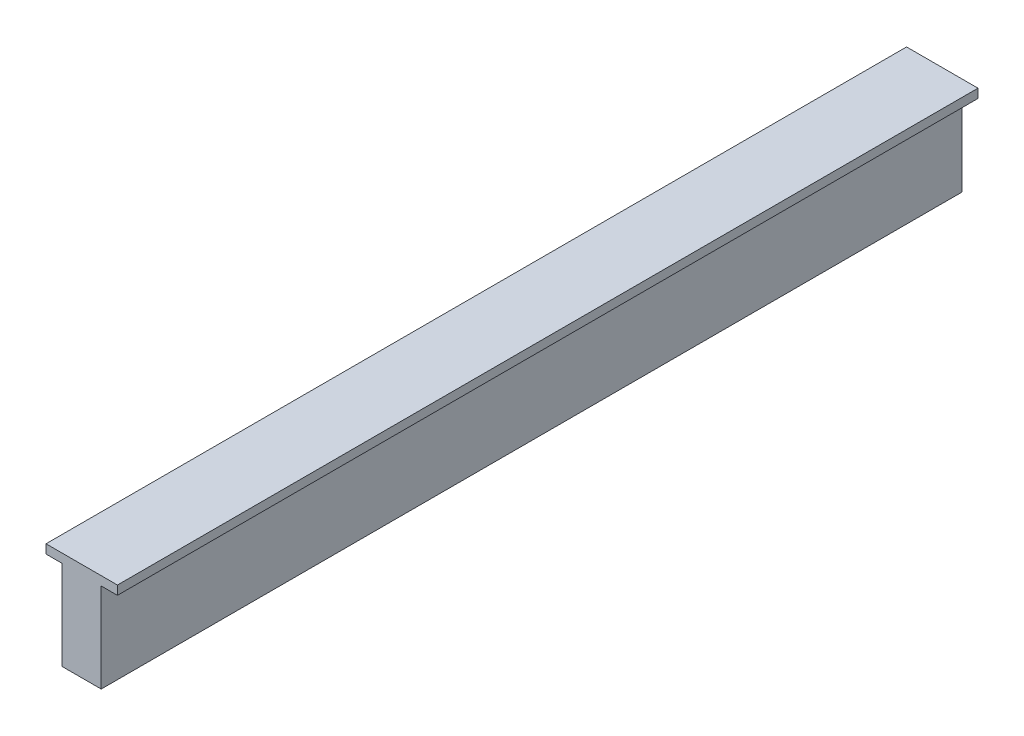
ISO-10303-21;
HEADER;
FILE_DESCRIPTION(('STEP AP214'),'2;1');
FILE_NAME('part.step','',(''),(''),'','','');
FILE_SCHEMA(('AUTOMOTIVE_DESIGN { 1 0 10303 214 1 1 1 1 }'));
ENDSEC;
DATA;
#1=APPLICATION_CONTEXT('core data for automotive mechanical design processes');
#2=APPLICATION_PROTOCOL_DEFINITION('international standard','automotive_design',2000,#1);
#3=PRODUCT_CONTEXT('',#1,'mechanical');
#4=PRODUCT('Part','Part','',(#3));
#5=PRODUCT_RELATED_PRODUCT_CATEGORY('part','',(#4));
#6=PRODUCT_DEFINITION_FORMATION('','',#4);
#7=PRODUCT_DEFINITION_CONTEXT('part definition',#1,'design');
#8=PRODUCT_DEFINITION('design','',#6,#7);
#9=PRODUCT_DEFINITION_SHAPE('','',#8);
#10=(LENGTH_UNIT() NAMED_UNIT(*) SI_UNIT(.MILLI.,.METRE.));
#11=(NAMED_UNIT(*) PLANE_ANGLE_UNIT() SI_UNIT($,.RADIAN.));
#12=(NAMED_UNIT(*) SI_UNIT($,.STERADIAN.) SOLID_ANGLE_UNIT());
#13=UNCERTAINTY_MEASURE_WITH_UNIT(LENGTH_MEASURE(1.E-05),#10,'distance_accuracy_value','');
#14=(GEOMETRIC_REPRESENTATION_CONTEXT(3) GLOBAL_UNCERTAINTY_ASSIGNED_CONTEXT((#13)) GLOBAL_UNIT_ASSIGNED_CONTEXT((#10,
#11,#12)) REPRESENTATION_CONTEXT('',''));
#15=CARTESIAN_POINT('',(0.,0.,0.));
#16=DIRECTION('',(0.,0.,1.));
#17=DIRECTION('',(1.,0.,0.));
#18=AXIS2_PLACEMENT_3D('',#15,#16,#17);
#19=CARTESIAN_POINT('',(-22.,-5.5,265.));
#20=DIRECTION('',(1.,0.,0.));
#21=DIRECTION('',(0.,0.,-1.));
#22=AXIS2_PLACEMENT_3D('',#19,#20,#21);
#23=PLANE('',#22);
#24=DIRECTION('',(0.,-1.,0.));
#25=VECTOR('',#24,1.);
#26=CARTESIAN_POINT('',(-22.,-5.5,-265.));
#27=LINE('',#26,#25);
#28=CARTESIAN_POINT('',(-22.,0.,-265.));
#29=VERTEX_POINT('',#28);
#30=CARTESIAN_POINT('',(-22.,-5.5,-265.));
#31=VERTEX_POINT('',#30);
#32=EDGE_CURVE('E140',#29,#31,#27,.T.);
#33=ORIENTED_EDGE('',*,*,#32,.T.);
#34=DIRECTION('',(0.,0.,-1.));
#35=VECTOR('',#34,1.);
#36=CARTESIAN_POINT('',(-22.,-5.5,265.));
#37=LINE('',#36,#35);
#38=CARTESIAN_POINT('',(-22.,-5.5,265.));
#39=VERTEX_POINT('',#38);
#40=EDGE_CURVE('E11',#39,#31,#37,.T.);
#41=ORIENTED_EDGE('',*,*,#40,.F.);
#42=DIRECTION('',(0.,-1.,0.));
#43=VECTOR('',#42,1.);
#44=CARTESIAN_POINT('',(-22.,-5.5,265.));
#45=LINE('',#44,#43);
#46=CARTESIAN_POINT('',(-22.,0.,265.));
#47=VERTEX_POINT('',#46);
#48=EDGE_CURVE('E162',#47,#39,#45,.T.);
#49=ORIENTED_EDGE('',*,*,#48,.F.);
#50=DIRECTION('',(0.,0.,-1.));
#51=VECTOR('',#50,1.);
#52=CARTESIAN_POINT('',(-22.,0.,265.));
#53=LINE('',#52,#51);
#54=EDGE_CURVE('E136',#47,#29,#53,.T.);
#55=ORIENTED_EDGE('',*,*,#54,.T.);
#56=EDGE_LOOP('',(#33,#41,#49,#55));
#57=FACE_BOUND('',#56,.T.);
#58=ADVANCED_FACE('F39',(#57),#23,.F.);
#59=CARTESIAN_POINT('',(-12.,-5.5,265.));
#60=DIRECTION('',(0.,1.,0.));
#61=DIRECTION('',(0.,0.,1.));
#62=AXIS2_PLACEMENT_3D('',#59,#60,#61);
#63=PLANE('',#62);
#64=DIRECTION('',(1.,0.,0.));
#65=VECTOR('',#64,1.);
#66=CARTESIAN_POINT('',(-12.,-5.5,-265.));
#67=LINE('',#66,#65);
#68=CARTESIAN_POINT('',(-12.,-5.5,-265.));
#69=VERTEX_POINT('',#68);
#70=EDGE_CURVE('E144',#31,#69,#67,.T.);
#71=ORIENTED_EDGE('',*,*,#70,.T.);
#72=DIRECTION('',(0.,0.,-1.));
#73=VECTOR('',#72,1.);
#74=CARTESIAN_POINT('',(-12.,-5.5,265.));
#75=LINE('',#74,#73);
#76=CARTESIAN_POINT('',(-12.,-5.5,265.));
#77=VERTEX_POINT('',#76);
#78=EDGE_CURVE('E48',#77,#69,#75,.T.);
#79=ORIENTED_EDGE('',*,*,#78,.F.);
#80=DIRECTION('',(1.,0.,0.));
#81=VECTOR('',#80,1.);
#82=CARTESIAN_POINT('',(-12.,-5.5,265.));
#83=LINE('',#82,#81);
#84=EDGE_CURVE('E99',#39,#77,#83,.T.);
#85=ORIENTED_EDGE('',*,*,#84,.F.);
#86=ORIENTED_EDGE('',*,*,#40,.T.);
#87=EDGE_LOOP('',(#71,#79,#85,#86));
#88=FACE_BOUND('',#87,.T.);
#89=ADVANCED_FACE('F208',(#88),#63,.F.);
#90=CARTESIAN_POINT('',(-12.,-60.5,265.));
#91=DIRECTION('',(1.,0.,0.));
#92=DIRECTION('',(0.,0.,-1.));
#93=AXIS2_PLACEMENT_3D('',#90,#91,#92);
#94=PLANE('',#93);
#95=DIRECTION('',(0.,-1.,0.));
#96=VECTOR('',#95,1.);
#97=CARTESIAN_POINT('',(-12.,-60.5,-265.));
#98=LINE('',#97,#96);
#99=CARTESIAN_POINT('',(-12.,-60.5,-265.));
#100=VERTEX_POINT('',#99);
#101=EDGE_CURVE('E147',#69,#100,#98,.T.);
#102=ORIENTED_EDGE('',*,*,#101,.T.);
#103=DIRECTION('',(0.,0.,-1.));
#104=VECTOR('',#103,1.);
#105=CARTESIAN_POINT('',(-12.,-60.5,265.));
#106=LINE('',#105,#104);
#107=CARTESIAN_POINT('',(-12.,-60.5,265.));
#108=VERTEX_POINT('',#107);
#109=EDGE_CURVE('E173',#108,#100,#106,.T.);
#110=ORIENTED_EDGE('',*,*,#109,.F.);
#111=DIRECTION('',(0.,-1.,0.));
#112=VECTOR('',#111,1.);
#113=CARTESIAN_POINT('',(-12.,-60.5,265.));
#114=LINE('',#113,#112);
#115=EDGE_CURVE('E183',#77,#108,#114,.T.);
#116=ORIENTED_EDGE('',*,*,#115,.F.);
#117=ORIENTED_EDGE('',*,*,#78,.T.);
#118=EDGE_LOOP('',(#102,#110,#116,#117));
#119=FACE_BOUND('',#118,.T.);
#120=ADVANCED_FACE('F181',(#119),#94,.F.);
#121=CARTESIAN_POINT('',(12.,-60.5,265.));
#122=DIRECTION('',(0.,1.,0.));
#123=DIRECTION('',(-1.,0.,0.));
#124=AXIS2_PLACEMENT_3D('',#121,#122,#123);
#125=PLANE('',#124);
#126=DIRECTION('',(1.,0.,0.));
#127=VECTOR('',#126,1.);
#128=CARTESIAN_POINT('',(12.,-60.5,-265.));
#129=LINE('',#128,#127);
#130=CARTESIAN_POINT('',(12.,-60.5,-265.));
#131=VERTEX_POINT('',#130);
#132=EDGE_CURVE('E150',#100,#131,#129,.T.);
#133=ORIENTED_EDGE('',*,*,#132,.T.);
#134=DIRECTION('',(0.,0.,-1.));
#135=VECTOR('',#134,1.);
#136=CARTESIAN_POINT('',(12.,-60.5,265.));
#137=LINE('',#136,#135);
#138=CARTESIAN_POINT('',(12.,-60.5,265.));
#139=VERTEX_POINT('',#138);
#140=EDGE_CURVE('E169',#139,#131,#137,.T.);
#141=ORIENTED_EDGE('',*,*,#140,.F.);
#142=DIRECTION('',(1.,0.,0.));
#143=VECTOR('',#142,1.);
#144=CARTESIAN_POINT('',(12.,-60.5,265.));
#145=LINE('',#144,#143);
#146=EDGE_CURVE('E196',#108,#139,#145,.T.);
#147=ORIENTED_EDGE('',*,*,#146,.F.);
#148=ORIENTED_EDGE('',*,*,#109,.T.);
#149=EDGE_LOOP('',(#133,#141,#147,#148));
#150=FACE_BOUND('',#149,.T.);
#151=ADVANCED_FACE('F191',(#150),#125,.F.);
#152=CARTESIAN_POINT('',(12.,-5.5,265.));
#153=DIRECTION('',(-1.,0.,0.));
#154=DIRECTION('',(0.,-1.,0.));
#155=AXIS2_PLACEMENT_3D('',#152,#153,#154);
#156=PLANE('',#155);
#157=DIRECTION('',(0.,1.,0.));
#158=VECTOR('',#157,1.);
#159=CARTESIAN_POINT('',(12.,-5.5,-265.));
#160=LINE('',#159,#158);
#161=CARTESIAN_POINT('',(12.,-5.5,-265.));
#162=VERTEX_POINT('',#161);
#163=EDGE_CURVE('E153',#131,#162,#160,.T.);
#164=ORIENTED_EDGE('',*,*,#163,.T.);
#165=DIRECTION('',(0.,0.,-1.));
#166=VECTOR('',#165,1.);
#167=CARTESIAN_POINT('',(12.,-5.5,265.));
#168=LINE('',#167,#166);
#169=CARTESIAN_POINT('',(12.,-5.5,265.));
#170=VERTEX_POINT('',#169);
#171=EDGE_CURVE('E129',#170,#162,#168,.T.);
#172=ORIENTED_EDGE('',*,*,#171,.F.);
#173=DIRECTION('',(0.,1.,0.));
#174=VECTOR('',#173,1.);
#175=CARTESIAN_POINT('',(12.,-5.5,265.));
#176=LINE('',#175,#174);
#177=EDGE_CURVE('E118',#139,#170,#176,.T.);
#178=ORIENTED_EDGE('',*,*,#177,.F.);
#179=ORIENTED_EDGE('',*,*,#140,.T.);
#180=EDGE_LOOP('',(#164,#172,#178,#179));
#181=FACE_BOUND('',#180,.T.);
#182=ADVANCED_FACE('F194',(#181),#156,.F.);
#183=CARTESIAN_POINT('',(22.,-5.49999999999999,265.));
#184=DIRECTION('',(0.,1.,0.));
#185=DIRECTION('',(-1.,0.,0.));
#186=AXIS2_PLACEMENT_3D('',#183,#184,#185);
#187=PLANE('',#186);
#188=DIRECTION('',(1.,0.,0.));
#189=VECTOR('',#188,1.);
#190=CARTESIAN_POINT('',(22.,-5.49999999999999,-265.));
#191=LINE('',#190,#189);
#192=CARTESIAN_POINT('',(22.,-5.49999999999999,-265.));
#193=VERTEX_POINT('',#192);
#194=EDGE_CURVE('E127',#162,#193,#191,.T.);
#195=ORIENTED_EDGE('',*,*,#194,.T.);
#196=DIRECTION('',(0.,0.,-1.));
#197=VECTOR('',#196,1.);
#198=CARTESIAN_POINT('',(22.,-5.49999999999999,265.));
#199=LINE('',#198,#197);
#200=CARTESIAN_POINT('',(22.,-5.49999999999999,265.));
#201=VERTEX_POINT('',#200);
#202=EDGE_CURVE('E124',#201,#193,#199,.T.);
#203=ORIENTED_EDGE('',*,*,#202,.F.);
#204=DIRECTION('',(1.,0.,0.));
#205=VECTOR('',#204,1.);
#206=CARTESIAN_POINT('',(22.,-5.49999999999999,265.));
#207=LINE('',#206,#205);
#208=EDGE_CURVE('E112',#170,#201,#207,.T.);
#209=ORIENTED_EDGE('',*,*,#208,.F.);
#210=ORIENTED_EDGE('',*,*,#171,.T.);
#211=EDGE_LOOP('',(#195,#203,#209,#210));
#212=FACE_BOUND('',#211,.T.);
#213=ADVANCED_FACE('F125',(#212),#187,.F.);
#214=CARTESIAN_POINT('',(22.,0.,265.));
#215=DIRECTION('',(-1.,0.,0.));
#216=DIRECTION('',(0.,0.,1.));
#217=AXIS2_PLACEMENT_3D('',#214,#215,#216);
#218=PLANE('',#217);
#219=DIRECTION('',(0.,1.,0.));
#220=VECTOR('',#219,1.);
#221=CARTESIAN_POINT('',(22.,0.,-265.));
#222=LINE('',#221,#220);
#223=CARTESIAN_POINT('',(22.,0.,-265.));
#224=VERTEX_POINT('',#223);
#225=EDGE_CURVE('E85',#193,#224,#222,.T.);
#226=ORIENTED_EDGE('',*,*,#225,.T.);
#227=DIRECTION('',(0.,0.,-1.));
#228=VECTOR('',#227,1.);
#229=CARTESIAN_POINT('',(22.,0.,265.));
#230=LINE('',#229,#228);
#231=CARTESIAN_POINT('',(22.,0.,265.));
#232=VERTEX_POINT('',#231);
#233=EDGE_CURVE('E130',#232,#224,#230,.T.);
#234=ORIENTED_EDGE('',*,*,#233,.F.);
#235=DIRECTION('',(0.,1.,0.));
#236=VECTOR('',#235,1.);
#237=CARTESIAN_POINT('',(22.,0.,265.));
#238=LINE('',#237,#236);
#239=EDGE_CURVE('E116',#201,#232,#238,.T.);
#240=ORIENTED_EDGE('',*,*,#239,.F.);
#241=ORIENTED_EDGE('',*,*,#202,.T.);
#242=EDGE_LOOP('',(#226,#234,#240,#241));
#243=FACE_BOUND('',#242,.T.);
#244=ADVANCED_FACE('F132',(#243),#218,.F.);
#245=CARTESIAN_POINT('',(-22.,0.,265.));
#246=DIRECTION('',(0.,-1.,0.));
#247=DIRECTION('',(1.,0.,0.));
#248=AXIS2_PLACEMENT_3D('',#245,#246,#247);
#249=PLANE('',#248);
#250=DIRECTION('',(-1.,0.,0.));
#251=VECTOR('',#250,1.);
#252=CARTESIAN_POINT('',(-22.,0.,-265.));
#253=LINE('',#252,#251);
#254=EDGE_CURVE('E91',#224,#29,#253,.T.);
#255=ORIENTED_EDGE('',*,*,#254,.T.);
#256=ORIENTED_EDGE('',*,*,#54,.F.);
#257=DIRECTION('',(-1.,0.,0.));
#258=VECTOR('',#257,1.);
#259=CARTESIAN_POINT('',(-22.,0.,265.));
#260=LINE('',#259,#258);
#261=EDGE_CURVE('E56',#232,#47,#260,.T.);
#262=ORIENTED_EDGE('',*,*,#261,.F.);
#263=ORIENTED_EDGE('',*,*,#233,.T.);
#264=EDGE_LOOP('',(#255,#256,#262,#263));
#265=FACE_BOUND('',#264,.T.);
#266=ADVANCED_FACE('F224',(#265),#249,.F.);
#267=CARTESIAN_POINT('',(0.,0.,265.));
#268=DIRECTION('',(0.,0.,-1.));
#269=DIRECTION('',(-1.,0.,0.));
#270=AXIS2_PLACEMENT_3D('',#267,#268,#269);
#271=PLANE('',#270);
#272=ORIENTED_EDGE('',*,*,#48,.T.);
#273=ORIENTED_EDGE('',*,*,#84,.T.);
#274=ORIENTED_EDGE('',*,*,#115,.T.);
#275=ORIENTED_EDGE('',*,*,#146,.T.);
#276=ORIENTED_EDGE('',*,*,#177,.T.);
#277=ORIENTED_EDGE('',*,*,#208,.T.);
#278=ORIENTED_EDGE('',*,*,#239,.T.);
#279=ORIENTED_EDGE('',*,*,#261,.T.);
#280=EDGE_LOOP('',(#272,#273,#274,#275,#276,#277,#278,#279));
#281=FACE_BOUND('',#280,.T.);
#282=ADVANCED_FACE('F114',(#281),#271,.F.);
#283=CARTESIAN_POINT('',(0.,0.,-265.));
#284=DIRECTION('',(0.,0.,-1.));
#285=DIRECTION('',(-1.,0.,0.));
#286=AXIS2_PLACEMENT_3D('',#283,#284,#285);
#287=PLANE('',#286);
#288=ORIENTED_EDGE('',*,*,#32,.F.);
#289=ORIENTED_EDGE('',*,*,#254,.F.);
#290=ORIENTED_EDGE('',*,*,#225,.F.);
#291=ORIENTED_EDGE('',*,*,#194,.F.);
#292=ORIENTED_EDGE('',*,*,#163,.F.);
#293=ORIENTED_EDGE('',*,*,#132,.F.);
#294=ORIENTED_EDGE('',*,*,#101,.F.);
#295=ORIENTED_EDGE('',*,*,#70,.F.);
#296=EDGE_LOOP('',(#288,#289,#290,#291,#292,#293,#294,#295));
#297=FACE_BOUND('',#296,.T.);
#298=ADVANCED_FACE('F187',(#297),#287,.T.);
#299=CLOSED_SHELL('',(#58,#89,#120,#151,#182,#213,#244,#266,#282,#298));
#300=MANIFOLD_SOLID_BREP('B2',#299);
#301=ADVANCED_BREP_SHAPE_REPRESENTATION('',(#18,#300),#14);
#302=SHAPE_DEFINITION_REPRESENTATION(#9,#301);
ENDSEC;
END-ISO-10303-21;
